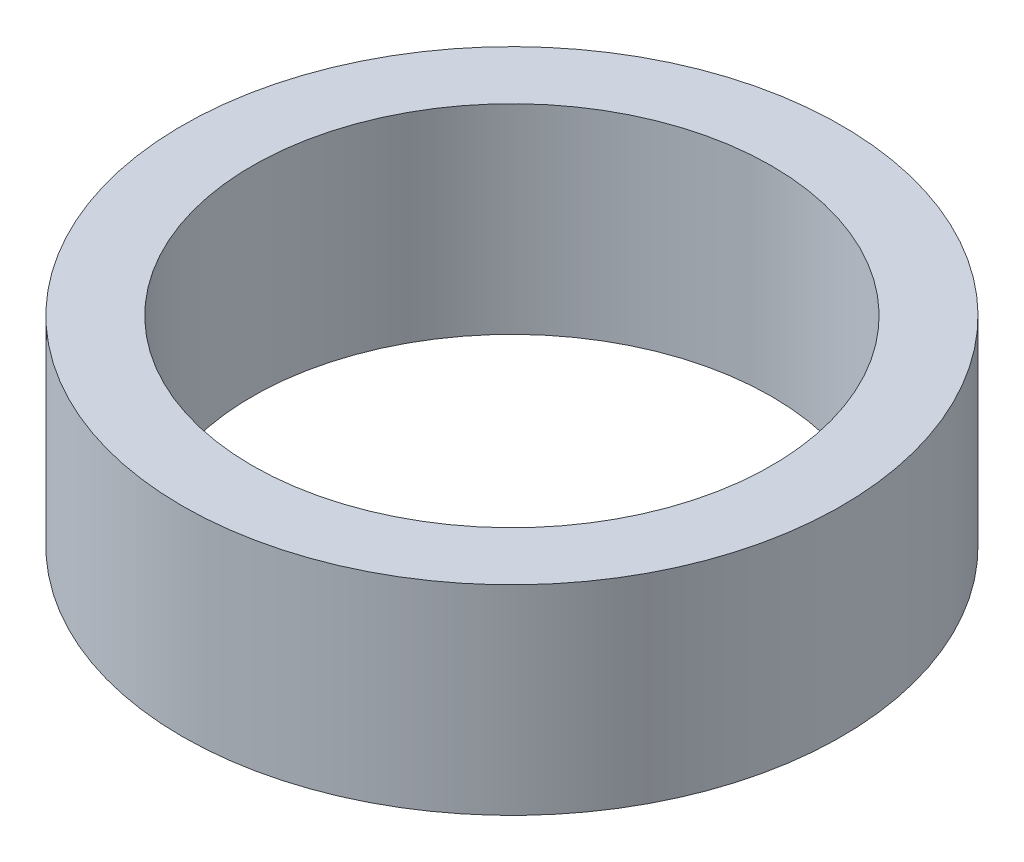
ISO-10303-21;
HEADER;
FILE_DESCRIPTION(('STEP AP214'),'2;1');
FILE_NAME('part.step','',(''),(''),'','','');
FILE_SCHEMA(('AUTOMOTIVE_DESIGN { 1 0 10303 214 1 1 1 1 }'));
ENDSEC;
DATA;
#1=APPLICATION_CONTEXT('core data for automotive mechanical design processes');
#2=APPLICATION_PROTOCOL_DEFINITION('international standard','automotive_design',2000,#1);
#3=PRODUCT_CONTEXT('',#1,'mechanical');
#4=PRODUCT('Part','Part','',(#3));
#5=PRODUCT_RELATED_PRODUCT_CATEGORY('part','',(#4));
#6=PRODUCT_DEFINITION_FORMATION('','',#4);
#7=PRODUCT_DEFINITION_CONTEXT('part definition',#1,'design');
#8=PRODUCT_DEFINITION('design','',#6,#7);
#9=PRODUCT_DEFINITION_SHAPE('','',#8);
#10=(LENGTH_UNIT() NAMED_UNIT(*) SI_UNIT(.MILLI.,.METRE.));
#11=(NAMED_UNIT(*) PLANE_ANGLE_UNIT() SI_UNIT($,.RADIAN.));
#12=(NAMED_UNIT(*) SI_UNIT($,.STERADIAN.) SOLID_ANGLE_UNIT());
#13=UNCERTAINTY_MEASURE_WITH_UNIT(LENGTH_MEASURE(1.E-05),#10,'distance_accuracy_value','');
#14=(GEOMETRIC_REPRESENTATION_CONTEXT(3) GLOBAL_UNCERTAINTY_ASSIGNED_CONTEXT((#13)) GLOBAL_UNIT_ASSIGNED_CONTEXT((#10,
#11,#12)) REPRESENTATION_CONTEXT('',''));
#15=CARTESIAN_POINT('',(0.,0.,0.));
#16=DIRECTION('',(0.,0.,1.));
#17=DIRECTION('',(1.,0.,0.));
#18=AXIS2_PLACEMENT_3D('',#15,#16,#17);
#19=CARTESIAN_POINT('',(0.,10.,0.));
#20=DIRECTION('',(0.,1.,0.));
#21=DIRECTION('',(0.,0.,1.));
#22=AXIS2_PLACEMENT_3D('',#19,#20,#21);
#23=PLANE('',#22);
#24=CARTESIAN_POINT('',(0.,10.,0.));
#25=DIRECTION('',(0.,1.,0.));
#26=DIRECTION('',(0.,0.,1.));
#27=AXIS2_PLACEMENT_3D('',#24,#25,#26);
#28=CIRCLE('',#27,16.5);
#29=CARTESIAN_POINT('',(0.,10.,16.5));
#30=VERTEX_POINT('',#29);
#31=EDGE_CURVE('E10',#30,#30,#28,.T.);
#32=ORIENTED_EDGE('',*,*,#31,.T.);
#33=EDGE_LOOP('',(#32));
#34=FACE_BOUND('',#33,.T.);
#35=CARTESIAN_POINT('',(0.,10.,0.));
#36=DIRECTION('',(0.,1.,0.));
#37=DIRECTION('',(0.,0.,1.));
#38=AXIS2_PLACEMENT_3D('',#35,#36,#37);
#39=CIRCLE('',#38,13.);
#40=CARTESIAN_POINT('',(0.,10.,13.));
#41=VERTEX_POINT('',#40);
#42=EDGE_CURVE('E50',#41,#41,#39,.T.);
#43=ORIENTED_EDGE('',*,*,#42,.F.);
#44=EDGE_LOOP('',(#43));
#45=FACE_BOUND('',#44,.T.);
#46=ADVANCED_FACE('F37',(#34,#45),#23,.T.);
#47=CARTESIAN_POINT('',(0.,0.,0.));
#48=DIRECTION('',(0.,1.,0.));
#49=DIRECTION('',(0.,0.,1.));
#50=AXIS2_PLACEMENT_3D('',#47,#48,#49);
#51=PLANE('',#50);
#52=CARTESIAN_POINT('',(0.,0.,0.));
#53=DIRECTION('',(0.,1.,0.));
#54=DIRECTION('',(0.,0.,1.));
#55=AXIS2_PLACEMENT_3D('',#52,#53,#54);
#56=CIRCLE('',#55,16.5);
#57=CARTESIAN_POINT('',(0.,0.,16.5));
#58=VERTEX_POINT('',#57);
#59=EDGE_CURVE('E41',#58,#58,#56,.T.);
#60=ORIENTED_EDGE('',*,*,#59,.F.);
#61=EDGE_LOOP('',(#60));
#62=FACE_BOUND('',#61,.T.);
#63=CARTESIAN_POINT('',(0.,0.,0.));
#64=DIRECTION('',(0.,1.,0.));
#65=DIRECTION('',(0.,0.,1.));
#66=AXIS2_PLACEMENT_3D('',#63,#64,#65);
#67=CIRCLE('',#66,13.);
#68=CARTESIAN_POINT('',(0.,0.,13.));
#69=VERTEX_POINT('',#68);
#70=EDGE_CURVE('E52',#69,#69,#67,.T.);
#71=ORIENTED_EDGE('',*,*,#70,.T.);
#72=EDGE_LOOP('',(#71));
#73=FACE_BOUND('',#72,.T.);
#74=ADVANCED_FACE('F64',(#62,#73),#51,.F.);
#75=CARTESIAN_POINT('',(0.,10.,0.));
#76=DIRECTION('',(0.,-1.,0.));
#77=DIRECTION('',(0.,0.,-1.));
#78=AXIS2_PLACEMENT_3D('',#75,#76,#77);
#79=CYLINDRICAL_SURFACE('',#78,16.5);
#80=ORIENTED_EDGE('',*,*,#31,.F.);
#81=EDGE_LOOP('',(#80));
#82=FACE_BOUND('',#81,.T.);
#83=ORIENTED_EDGE('',*,*,#59,.T.);
#84=EDGE_LOOP('',(#83));
#85=FACE_BOUND('',#84,.T.);
#86=ADVANCED_FACE('F39',(#82,#85),#79,.T.);
#87=CARTESIAN_POINT('',(0.,10.,0.));
#88=DIRECTION('',(0.,-1.,0.));
#89=DIRECTION('',(0.,0.,-1.));
#90=AXIS2_PLACEMENT_3D('',#87,#88,#89);
#91=CYLINDRICAL_SURFACE('',#90,13.);
#92=ORIENTED_EDGE('',*,*,#42,.T.);
#93=EDGE_LOOP('',(#92));
#94=FACE_BOUND('',#93,.T.);
#95=ORIENTED_EDGE('',*,*,#70,.F.);
#96=EDGE_LOOP('',(#95));
#97=FACE_BOUND('',#96,.T.);
#98=ADVANCED_FACE('F60',(#94,#97),#91,.F.);
#99=CLOSED_SHELL('',(#46,#74,#86,#98));
#100=MANIFOLD_SOLID_BREP('B2',#99);
#101=ADVANCED_BREP_SHAPE_REPRESENTATION('',(#18,#100),#14);
#102=SHAPE_DEFINITION_REPRESENTATION(#9,#101);
ENDSEC;
END-ISO-10303-21;
